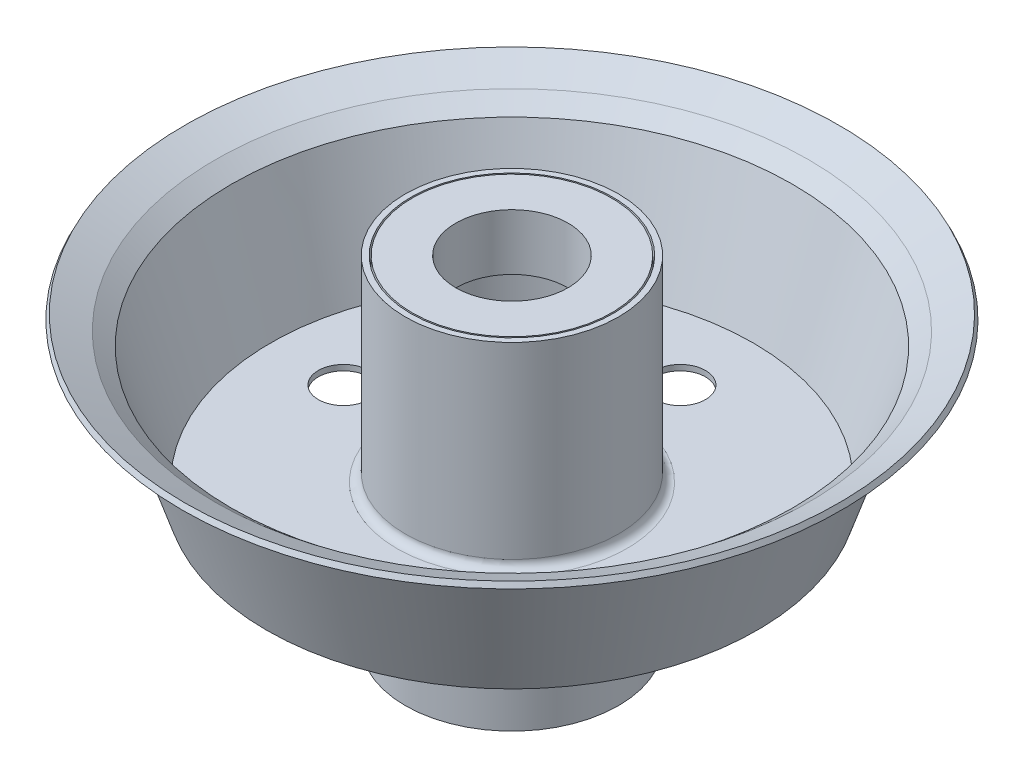
ISO-10303-21;
HEADER;
FILE_DESCRIPTION(('STEP AP214'),'2;1');
FILE_NAME('part.step','',(''),(''),'','','');
FILE_SCHEMA(('AUTOMOTIVE_DESIGN { 1 0 10303 214 1 1 1 1 }'));
ENDSEC;
DATA;
#1=APPLICATION_CONTEXT('core data for automotive mechanical design processes');
#2=APPLICATION_PROTOCOL_DEFINITION('international standard','automotive_design',2000,#1);
#3=PRODUCT_CONTEXT('',#1,'mechanical');
#4=PRODUCT('Part','Part','',(#3));
#5=PRODUCT_RELATED_PRODUCT_CATEGORY('part','',(#4));
#6=PRODUCT_DEFINITION_FORMATION('','',#4);
#7=PRODUCT_DEFINITION_CONTEXT('part definition',#1,'design');
#8=PRODUCT_DEFINITION('design','',#6,#7);
#9=PRODUCT_DEFINITION_SHAPE('','',#8);
#10=(LENGTH_UNIT() NAMED_UNIT(*) SI_UNIT(.MILLI.,.METRE.));
#11=(NAMED_UNIT(*) PLANE_ANGLE_UNIT() SI_UNIT($,.RADIAN.));
#12=(NAMED_UNIT(*) SI_UNIT($,.STERADIAN.) SOLID_ANGLE_UNIT());
#13=UNCERTAINTY_MEASURE_WITH_UNIT(LENGTH_MEASURE(1.E-05),#10,'distance_accuracy_value','');
#14=(GEOMETRIC_REPRESENTATION_CONTEXT(3) GLOBAL_UNCERTAINTY_ASSIGNED_CONTEXT((#13)) GLOBAL_UNIT_ASSIGNED_CONTEXT((#10,
#11,#12)) REPRESENTATION_CONTEXT('',''));
#15=CARTESIAN_POINT('',(0.,0.,0.));
#16=DIRECTION('',(0.,0.,1.));
#17=DIRECTION('',(1.,0.,0.));
#18=AXIS2_PLACEMENT_3D('',#15,#16,#17);
#19=CARTESIAN_POINT('',(0.,-25.,0.));
#20=DIRECTION('',(0.,1.,0.));
#21=DIRECTION('',(0.,0.,1.));
#22=AXIS2_PLACEMENT_3D('',#19,#20,#21);
#23=CYLINDRICAL_SURFACE('',#22,17.75);
#24=CARTESIAN_POINT('',(0.,-25.,0.));
#25=DIRECTION('',(0.,1.,0.));
#26=DIRECTION('',(0.,0.,1.));
#27=AXIS2_PLACEMENT_3D('',#24,#25,#26);
#28=CIRCLE('',#27,17.75);
#29=CARTESIAN_POINT('',(0.,-25.,17.75));
#30=VERTEX_POINT('',#29);
#31=EDGE_CURVE('E11',#30,#30,#28,.T.);
#32=ORIENTED_EDGE('',*,*,#31,.T.);
#33=EDGE_LOOP('',(#32));
#34=FACE_BOUND('',#33,.T.);
#35=CARTESIAN_POINT('',(0.,-15.,0.));
#36=DIRECTION('',(0.,1.,0.));
#37=DIRECTION('',(0.,0.,1.));
#38=AXIS2_PLACEMENT_3D('',#35,#36,#37);
#39=CIRCLE('',#38,17.75);
#40=CARTESIAN_POINT('',(0.,-15.,17.75));
#41=VERTEX_POINT('',#40);
#42=EDGE_CURVE('E40',#41,#41,#39,.T.);
#43=ORIENTED_EDGE('',*,*,#42,.F.);
#44=EDGE_LOOP('',(#43));
#45=FACE_BOUND('',#44,.T.);
#46=ADVANCED_FACE('F37',(#34,#45),#23,.T.);
#47=CARTESIAN_POINT('',(0.,-25.,0.));
#48=DIRECTION('',(0.,1.,0.));
#49=DIRECTION('',(0.,0.,1.));
#50=AXIS2_PLACEMENT_3D('',#47,#48,#49);
#51=PLANE('',#50);
#52=CARTESIAN_POINT('',(0.,-25.,0.));
#53=DIRECTION('',(0.,1.,0.));
#54=DIRECTION('',(0.,0.,1.));
#55=AXIS2_PLACEMENT_3D('',#52,#53,#54);
#56=CIRCLE('',#55,10.);
#57=CARTESIAN_POINT('',(0.,-25.,10.));
#58=VERTEX_POINT('',#57);
#59=EDGE_CURVE('E47',#58,#58,#56,.T.);
#60=ORIENTED_EDGE('',*,*,#59,.T.);
#61=EDGE_LOOP('',(#60));
#62=FACE_BOUND('',#61,.T.);
#63=ORIENTED_EDGE('',*,*,#31,.F.);
#64=EDGE_LOOP('',(#63));
#65=FACE_BOUND('',#64,.T.);
#66=ADVANCED_FACE('F55',(#62,#65),#51,.F.);
#67=CARTESIAN_POINT('',(0.,-15.,0.));
#68=DIRECTION('',(0.,1.,0.));
#69=DIRECTION('',(0.,0.,1.));
#70=AXIS2_PLACEMENT_3D('',#67,#68,#69);
#71=PLANE('',#70);
#72=CARTESIAN_POINT('',(0.,-15.,0.));
#73=DIRECTION('',(0.,1.,0.));
#74=DIRECTION('',(0.,0.,1.));
#75=AXIS2_PLACEMENT_3D('',#72,#73,#74);
#76=CIRCLE('',#75,10.);
#77=CARTESIAN_POINT('',(0.,-15.,10.));
#78=VERTEX_POINT('',#77);
#79=EDGE_CURVE('E49',#78,#78,#76,.T.);
#80=ORIENTED_EDGE('',*,*,#79,.F.);
#81=EDGE_LOOP('',(#80));
#82=FACE_BOUND('',#81,.T.);
#83=ORIENTED_EDGE('',*,*,#42,.T.);
#84=EDGE_LOOP('',(#83));
#85=FACE_BOUND('',#84,.T.);
#86=ADVANCED_FACE('F61',(#82,#85),#71,.T.);
#87=CARTESIAN_POINT('',(0.,-25.,0.));
#88=DIRECTION('',(0.,1.,0.));
#89=DIRECTION('',(0.,0.,1.));
#90=AXIS2_PLACEMENT_3D('',#87,#88,#89);
#91=CYLINDRICAL_SURFACE('',#90,10.);
#92=ORIENTED_EDGE('',*,*,#59,.F.);
#93=EDGE_LOOP('',(#92));
#94=FACE_BOUND('',#93,.T.);
#95=ORIENTED_EDGE('',*,*,#79,.T.);
#96=EDGE_LOOP('',(#95));
#97=FACE_BOUND('',#96,.T.);
#98=ADVANCED_FACE('F58',(#94,#97),#91,.F.);
#99=CLOSED_SHELL('',(#46,#66,#86,#98));
#100=MANIFOLD_SOLID_BREP('B2',#99);
#101=CARTESIAN_POINT('',(0.,35.,0.));
#102=DIRECTION('',(0.,1.,0.));
#103=DIRECTION('',(0.,0.,1.));
#104=AXIS2_PLACEMENT_3D('',#101,#102,#103);
#105=PLANE('',#104);
#106=CARTESIAN_POINT('',(0.,35.,0.));
#107=DIRECTION('',(0.,1.,0.));
#108=DIRECTION('',(0.,0.,1.));
#109=AXIS2_PLACEMENT_3D('',#106,#107,#108);
#110=CIRCLE('',#109,17.75);
#111=CARTESIAN_POINT('',(0.,35.,17.75));
#112=VERTEX_POINT('',#111);
#113=EDGE_CURVE('E36',#112,#112,#110,.T.);
#114=ORIENTED_EDGE('',*,*,#113,.T.);
#115=EDGE_LOOP('',(#114));
#116=FACE_BOUND('',#115,.T.);
#117=CARTESIAN_POINT('',(0.,35.,0.));
#118=DIRECTION('',(0.,1.,0.));
#119=DIRECTION('',(0.,0.,1.));
#120=AXIS2_PLACEMENT_3D('',#117,#118,#119);
#121=CIRCLE('',#120,10.);
#122=CARTESIAN_POINT('',(0.,35.,10.));
#123=VERTEX_POINT('',#122);
#124=EDGE_CURVE('E116',#123,#123,#121,.T.);
#125=ORIENTED_EDGE('',*,*,#124,.F.);
#126=EDGE_LOOP('',(#125));
#127=FACE_BOUND('',#126,.T.);
#128=ADVANCED_FACE('F105',(#116,#127),#105,.T.);
#129=CARTESIAN_POINT('',(0.,25.,0.));
#130=DIRECTION('',(0.,1.,0.));
#131=DIRECTION('',(0.,0.,1.));
#132=AXIS2_PLACEMENT_3D('',#129,#130,#131);
#133=PLANE('',#132);
#134=CARTESIAN_POINT('',(0.,25.,0.));
#135=DIRECTION('',(0.,1.,0.));
#136=DIRECTION('',(0.,0.,1.));
#137=AXIS2_PLACEMENT_3D('',#134,#135,#136);
#138=CIRCLE('',#137,17.75);
#139=CARTESIAN_POINT('',(0.,25.,17.75));
#140=VERTEX_POINT('',#139);
#141=EDGE_CURVE('E109',#140,#140,#138,.T.);
#142=ORIENTED_EDGE('',*,*,#141,.F.);
#143=EDGE_LOOP('',(#142));
#144=FACE_BOUND('',#143,.T.);
#145=CARTESIAN_POINT('',(0.,25.,0.));
#146=DIRECTION('',(0.,1.,0.));
#147=DIRECTION('',(0.,0.,1.));
#148=AXIS2_PLACEMENT_3D('',#145,#146,#147);
#149=CIRCLE('',#148,10.);
#150=CARTESIAN_POINT('',(0.,25.,10.));
#151=VERTEX_POINT('',#150);
#152=EDGE_CURVE('E118',#151,#151,#149,.T.);
#153=ORIENTED_EDGE('',*,*,#152,.T.);
#154=EDGE_LOOP('',(#153));
#155=FACE_BOUND('',#154,.T.);
#156=ADVANCED_FACE('F128',(#144,#155),#133,.F.);
#157=CARTESIAN_POINT('',(0.,35.,0.));
#158=DIRECTION('',(0.,-1.,0.));
#159=DIRECTION('',(0.,0.,-1.));
#160=AXIS2_PLACEMENT_3D('',#157,#158,#159);
#161=CYLINDRICAL_SURFACE('',#160,17.75);
#162=ORIENTED_EDGE('',*,*,#113,.F.);
#163=EDGE_LOOP('',(#162));
#164=FACE_BOUND('',#163,.T.);
#165=ORIENTED_EDGE('',*,*,#141,.T.);
#166=EDGE_LOOP('',(#165));
#167=FACE_BOUND('',#166,.T.);
#168=ADVANCED_FACE('F107',(#164,#167),#161,.T.);
#169=CARTESIAN_POINT('',(0.,35.,0.));
#170=DIRECTION('',(0.,-1.,0.));
#171=DIRECTION('',(0.,0.,-1.));
#172=AXIS2_PLACEMENT_3D('',#169,#170,#171);
#173=CYLINDRICAL_SURFACE('',#172,10.);
#174=ORIENTED_EDGE('',*,*,#124,.T.);
#175=EDGE_LOOP('',(#174));
#176=FACE_BOUND('',#175,.T.);
#177=ORIENTED_EDGE('',*,*,#152,.F.);
#178=EDGE_LOOP('',(#177));
#179=FACE_BOUND('',#178,.T.);
#180=ADVANCED_FACE('F124',(#176,#179),#173,.F.);
#181=CLOSED_SHELL('',(#128,#156,#168,#180));
#182=MANIFOLD_SOLID_BREP('B6',#181);
#183=CARTESIAN_POINT('',(0.,22.482072549379,0.));
#184=DIRECTION('',(0.,1.,0.));
#185=DIRECTION('',(0.,0.,1.));
#186=AXIS2_PLACEMENT_3D('',#183,#184,#185);
#187=CONICAL_SURFACE('',#186,53.4284746095807,1.11990759501973);
#188=CARTESIAN_POINT('',(0.,25.052946122985,0.));
#189=DIRECTION('',(0.,1.,0.));
#190=DIRECTION('',(0.,0.,1.));
#191=AXIS2_PLACEMENT_3D('',#188,#189,#190);
#192=CIRCLE('',#191,58.738533119433);
#193=CARTESIAN_POINT('',(0.,25.052946122985,58.738533119433));
#194=VERTEX_POINT('',#193);
#195=EDGE_CURVE('E228',#194,#194,#192,.T.);
#196=ORIENTED_EDGE('',*,*,#195,.F.);
#197=EDGE_LOOP('',(#196));
#198=FACE_BOUND('',#197,.T.);
#199=CARTESIAN_POINT('',(0.,22.482072549379,0.));
#200=DIRECTION('',(0.,1.,0.));
#201=DIRECTION('',(0.,0.,1.));
#202=AXIS2_PLACEMENT_3D('',#199,#200,#201);
#203=CIRCLE('',#202,53.4284746095807);
#204=CARTESIAN_POINT('',(0.,22.482072549379,53.4284746095807));
#205=VERTEX_POINT('',#204);
#206=EDGE_CURVE('E180',#205,#205,#203,.T.);
#207=ORIENTED_EDGE('',*,*,#206,.T.);
#208=EDGE_LOOP('',(#207));
#209=FACE_BOUND('',#208,.T.);
#210=ADVANCED_FACE('F167',(#198,#209),#187,.T.);
#211=CARTESIAN_POINT('',(0.,20.4058385928895,0.));
#212=DIRECTION('',(0.,1.,0.));
#213=DIRECTION('',(0.,0.,1.));
#214=AXIS2_PLACEMENT_3D('',#211,#212,#213);
#215=CONICAL_SURFACE('',#214,50.8560387510196,0.891736147908962);
#216=ORIENTED_EDGE('',*,*,#206,.F.);
#217=EDGE_LOOP('',(#216));
#218=FACE_BOUND('',#217,.T.);
#219=CARTESIAN_POINT('',(0.,20.4058385928895,0.));
#220=DIRECTION('',(0.,1.,0.));
#221=DIRECTION('',(0.,0.,1.));
#222=AXIS2_PLACEMENT_3D('',#219,#220,#221);
#223=CIRCLE('',#222,50.8560387510196);
#224=CARTESIAN_POINT('',(0.,20.4058385928895,50.8560387510196));
#225=VERTEX_POINT('',#224);
#226=EDGE_CURVE('E246',#225,#225,#223,.T.);
#227=ORIENTED_EDGE('',*,*,#226,.T.);
#228=EDGE_LOOP('',(#227));
#229=FACE_BOUND('',#228,.T.);
#230=ADVANCED_FACE('F288',(#218,#229),#215,.T.);
#231=CARTESIAN_POINT('',(0.,-1.00000000000821,0.));
#232=DIRECTION('',(0.,1.,0.));
#233=DIRECTION('',(0.,0.,1.));
#234=AXIS2_PLACEMENT_3D('',#231,#232,#233);
#235=CONICAL_SURFACE('',#234,43.7207592200747,0.321750554395756);
#236=ORIENTED_EDGE('',*,*,#226,.F.);
#237=EDGE_LOOP('',(#236));
#238=FACE_BOUND('',#237,.T.);
#239=CARTESIAN_POINT('',(0.,-1.00000000000821,0.));
#240=DIRECTION('',(0.,1.,0.));
#241=DIRECTION('',(0.,0.,1.));
#242=AXIS2_PLACEMENT_3D('',#239,#240,#241);
#243=CIRCLE('',#242,43.7207592200747);
#244=CARTESIAN_POINT('',(0.,-1.00000000000821,43.7207592200747));
#245=VERTEX_POINT('',#244);
#246=EDGE_CURVE('E243',#245,#245,#243,.T.);
#247=ORIENTED_EDGE('',*,*,#246,.T.);
#248=EDGE_LOOP('',(#247));
#249=FACE_BOUND('',#248,.T.);
#250=ADVANCED_FACE('F293',(#238,#249),#235,.T.);
#251=CARTESIAN_POINT('',(19.0000000000179,-1.00000000000821,0.));
#252=DIRECTION('',(0.,1.,0.));
#253=DIRECTION('',(0.,0.,1.));
#254=AXIS2_PLACEMENT_3D('',#251,#252,#253);
#255=PLANE('',#254);
#256=CARTESIAN_POINT('',(22.360679775022,-1.00000000000821,20.));
#257=DIRECTION('',(0.,1.,0.));
#258=DIRECTION('',(0.,0.,1.));
#259=AXIS2_PLACEMENT_3D('',#256,#257,#258);
#260=CIRCLE('',#259,3.);
#261=CARTESIAN_POINT('',(22.360679775022,-1.00000000000821,23.));
#262=VERTEX_POINT('',#261);
#263=EDGE_CURVE('E186',#262,#262,#260,.T.);
#264=ORIENTED_EDGE('',*,*,#263,.T.);
#265=EDGE_LOOP('',(#264));
#266=FACE_BOUND('',#265,.T.);
#267=CARTESIAN_POINT('',(-22.360679775022,-1.00000000000821,-20.));
#268=DIRECTION('',(0.,1.,0.));
#269=DIRECTION('',(0.,0.,1.));
#270=AXIS2_PLACEMENT_3D('',#267,#268,#269);
#271=CIRCLE('',#270,3.);
#272=CARTESIAN_POINT('',(-22.360679775022,-1.00000000000821,-17.));
#273=VERTEX_POINT('',#272);
#274=EDGE_CURVE('E185',#273,#273,#271,.T.);
#275=ORIENTED_EDGE('',*,*,#274,.T.);
#276=EDGE_LOOP('',(#275));
#277=FACE_BOUND('',#276,.T.);
#278=CARTESIAN_POINT('',(0.,-1.00000000000821,30.0000000000179));
#279=DIRECTION('',(0.,1.,0.));
#280=DIRECTION('',(0.,0.,1.));
#281=AXIS2_PLACEMENT_3D('',#278,#279,#280);
#282=CIRCLE('',#281,4.49999999999999);
#283=CARTESIAN_POINT('',(0.,-1.00000000000821,34.5000000000179));
#284=VERTEX_POINT('',#283);
#285=EDGE_CURVE('E213',#284,#284,#282,.T.);
#286=ORIENTED_EDGE('',*,*,#285,.T.);
#287=EDGE_LOOP('',(#286));
#288=FACE_BOUND('',#287,.T.);
#289=CARTESIAN_POINT('',(0.,-1.00000000000821,-30.0000000000179));
#290=DIRECTION('',(0.,1.,0.));
#291=DIRECTION('',(0.,0.,1.));
#292=AXIS2_PLACEMENT_3D('',#289,#290,#291);
#293=CIRCLE('',#292,4.5);
#294=CARTESIAN_POINT('',(0.,-1.00000000000821,-25.5000000000179));
#295=VERTEX_POINT('',#294);
#296=EDGE_CURVE('E217',#295,#295,#293,.T.);
#297=ORIENTED_EDGE('',*,*,#296,.T.);
#298=EDGE_LOOP('',(#297));
#299=FACE_BOUND('',#298,.T.);
#300=CARTESIAN_POINT('',(-30.0000000000179,-1.00000000000821,0.));
#301=DIRECTION('',(0.,1.,0.));
#302=DIRECTION('',(0.,0.,1.));
#303=AXIS2_PLACEMENT_3D('',#300,#301,#302);
#304=CIRCLE('',#303,4.5);
#305=CARTESIAN_POINT('',(-30.0000000000179,-1.00000000000821,4.5));
#306=VERTEX_POINT('',#305);
#307=EDGE_CURVE('E221',#306,#306,#304,.T.);
#308=ORIENTED_EDGE('',*,*,#307,.T.);
#309=EDGE_LOOP('',(#308));
#310=FACE_BOUND('',#309,.T.);
#311=CARTESIAN_POINT('',(30.0000000000179,-1.00000000000821,0.));
#312=DIRECTION('',(0.,1.,0.));
#313=DIRECTION('',(0.,0.,1.));
#314=AXIS2_PLACEMENT_3D('',#311,#312,#313);
#315=CIRCLE('',#314,4.5);
#316=CARTESIAN_POINT('',(30.0000000000179,-1.00000000000821,4.5));
#317=VERTEX_POINT('',#316);
#318=EDGE_CURVE('E225',#317,#317,#315,.T.);
#319=ORIENTED_EDGE('',*,*,#318,.T.);
#320=EDGE_LOOP('',(#319));
#321=FACE_BOUND('',#320,.T.);
#322=ORIENTED_EDGE('',*,*,#246,.F.);
#323=EDGE_LOOP('',(#322));
#324=FACE_BOUND('',#323,.T.);
#325=CARTESIAN_POINT('',(0.,-1.00000000000821,0.));
#326=DIRECTION('',(0.,1.,0.));
#327=DIRECTION('',(0.,0.,1.));
#328=AXIS2_PLACEMENT_3D('',#325,#326,#327);
#329=CIRCLE('',#328,19.0000000000179);
#330=CARTESIAN_POINT('',(0.,-1.00000000000821,19.0000000000179));
#331=VERTEX_POINT('',#330);
#332=EDGE_CURVE('E209',#331,#331,#329,.F.);
#333=ORIENTED_EDGE('',*,*,#332,.F.);
#334=EDGE_LOOP('',(#333));
#335=FACE_BOUND('',#334,.T.);
#336=ADVANCED_FACE('F266',(#266,#277,#288,#299,#310,#321,#324,#335),#255,.F.);
#337=CARTESIAN_POINT('',(19.0000000000179,-8.20985384275657E-12,0.));
#338=DIRECTION('',(0.,1.,0.));
#339=DIRECTION('',(0.,0.,1.));
#340=AXIS2_PLACEMENT_3D('',#337,#338,#339);
#341=PLANE('',#340);
#342=CARTESIAN_POINT('',(22.360679775022,-8.21044621179823E-12,20.));
#343=DIRECTION('',(0.,1.,0.));
#344=DIRECTION('',(0.,0.,1.));
#345=AXIS2_PLACEMENT_3D('',#342,#343,#344);
#346=CIRCLE('',#345,3.);
#347=CARTESIAN_POINT('',(22.360679775022,-8.21044621179823E-12,23.));
#348=VERTEX_POINT('',#347);
#349=EDGE_CURVE('E171',#348,#348,#346,.T.);
#350=ORIENTED_EDGE('',*,*,#349,.F.);
#351=EDGE_LOOP('',(#350));
#352=FACE_BOUND('',#351,.T.);
#353=CARTESIAN_POINT('',(-22.360679775022,-8.21044621179823E-12,-20.));
#354=DIRECTION('',(0.,1.,0.));
#355=DIRECTION('',(0.,0.,1.));
#356=AXIS2_PLACEMENT_3D('',#353,#354,#355);
#357=CIRCLE('',#356,3.);
#358=CARTESIAN_POINT('',(-22.360679775022,-8.21044621179823E-12,-17.));
#359=VERTEX_POINT('',#358);
#360=EDGE_CURVE('E183',#359,#359,#357,.T.);
#361=ORIENTED_EDGE('',*,*,#360,.F.);
#362=EDGE_LOOP('',(#361));
#363=FACE_BOUND('',#362,.T.);
#364=CARTESIAN_POINT('',(0.,-8.20979569049474E-12,0.));
#365=DIRECTION('',(0.,1.,0.));
#366=DIRECTION('',(0.,0.,1.));
#367=AXIS2_PLACEMENT_3D('',#364,#365,#366);
#368=CIRCLE('',#367,20.5000000000179);
#369=CARTESIAN_POINT('',(0.,-8.20979569049474E-12,20.5000000000179));
#370=VERTEX_POINT('',#369);
#371=EDGE_CURVE('E104',#370,#370,#368,.F.);
#372=ORIENTED_EDGE('',*,*,#371,.T.);
#373=EDGE_LOOP('',(#372));
#374=FACE_BOUND('',#373,.T.);
#375=CARTESIAN_POINT('',(0.,-8.20871148832225E-12,30.0000000000179));
#376=DIRECTION('',(0.,1.,0.));
#377=DIRECTION('',(0.,0.,1.));
#378=AXIS2_PLACEMENT_3D('',#375,#376,#377);
#379=CIRCLE('',#378,4.49999999999999);
#380=CARTESIAN_POINT('',(0.,-8.20871148832225E-12,34.5000000000179));
#381=VERTEX_POINT('',#380);
#382=EDGE_CURVE('E212',#381,#381,#379,.T.);
#383=ORIENTED_EDGE('',*,*,#382,.F.);
#384=EDGE_LOOP('',(#383));
#385=FACE_BOUND('',#384,.T.);
#386=CARTESIAN_POINT('',(0.,-8.20871148832225E-12,-30.0000000000179));
#387=DIRECTION('',(0.,1.,0.));
#388=DIRECTION('',(0.,0.,1.));
#389=AXIS2_PLACEMENT_3D('',#386,#387,#388);
#390=CIRCLE('',#389,4.5);
#391=CARTESIAN_POINT('',(0.,-8.20871148832225E-12,-25.5000000000179));
#392=VERTEX_POINT('',#391);
#393=EDGE_CURVE('E216',#392,#392,#390,.T.);
#394=ORIENTED_EDGE('',*,*,#393,.F.);
#395=EDGE_LOOP('',(#394));
#396=FACE_BOUND('',#395,.T.);
#397=CARTESIAN_POINT('',(-30.0000000000179,-8.20871148832225E-12,0.));
#398=DIRECTION('',(0.,1.,0.));
#399=DIRECTION('',(0.,0.,1.));
#400=AXIS2_PLACEMENT_3D('',#397,#398,#399);
#401=CIRCLE('',#400,4.5);
#402=CARTESIAN_POINT('',(-30.0000000000179,-8.20871148832225E-12,4.5));
#403=VERTEX_POINT('',#402);
#404=EDGE_CURVE('E220',#403,#403,#401,.T.);
#405=ORIENTED_EDGE('',*,*,#404,.F.);
#406=EDGE_LOOP('',(#405));
#407=FACE_BOUND('',#406,.T.);
#408=CARTESIAN_POINT('',(30.0000000000179,-8.20871148832225E-12,0.));
#409=DIRECTION('',(0.,1.,0.));
#410=DIRECTION('',(0.,0.,1.));
#411=AXIS2_PLACEMENT_3D('',#408,#409,#410);
#412=CIRCLE('',#411,4.5);
#413=CARTESIAN_POINT('',(30.0000000000179,-8.20871148832225E-12,4.5));
#414=VERTEX_POINT('',#413);
#415=EDGE_CURVE('E224',#414,#414,#412,.T.);
#416=ORIENTED_EDGE('',*,*,#415,.F.);
#417=EDGE_LOOP('',(#416));
#418=FACE_BOUND('',#417,.T.);
#419=CARTESIAN_POINT('',(0.,-8.20985384275657E-12,0.));
#420=DIRECTION('',(0.,1.,0.));
#421=DIRECTION('',(0.,0.,1.));
#422=AXIS2_PLACEMENT_3D('',#419,#420,#421);
#423=CIRCLE('',#422,43.0000000000179);
#424=CARTESIAN_POINT('',(0.,-8.20985384275657E-12,43.0000000000179));
#425=VERTEX_POINT('',#424);
#426=EDGE_CURVE('E240',#425,#425,#423,.T.);
#427=ORIENTED_EDGE('',*,*,#426,.T.);
#428=EDGE_LOOP('',(#427));
#429=FACE_BOUND('',#428,.T.);
#430=ADVANCED_FACE('F262',(#352,#363,#374,#385,#396,#407,#418,#429),#341,.T.);
#431=CARTESIAN_POINT('',(0.,-8.20985384275657E-12,0.));
#432=DIRECTION('',(0.,1.,0.));
#433=DIRECTION('',(0.,0.,1.));
#434=AXIS2_PLACEMENT_3D('',#431,#432,#433);
#435=CONICAL_SURFACE('',#434,43.0000000000179,0.321750554395756);
#436=CARTESIAN_POINT('',(0.,21.,0.));
#437=DIRECTION('',(0.,1.,0.));
#438=DIRECTION('',(0.,0.,1.));
#439=AXIS2_PLACEMENT_3D('',#436,#437,#438);
#440=CIRCLE('',#439,50.);
#441=CARTESIAN_POINT('',(0.,21.,50.));
#442=VERTEX_POINT('',#441);
#443=EDGE_CURVE('E237',#442,#442,#440,.T.);
#444=ORIENTED_EDGE('',*,*,#443,.T.);
#445=EDGE_LOOP('',(#444));
#446=FACE_BOUND('',#445,.T.);
#447=ORIENTED_EDGE('',*,*,#426,.F.);
#448=EDGE_LOOP('',(#447));
#449=FACE_BOUND('',#448,.T.);
#450=ADVANCED_FACE('F265',(#446,#449),#435,.F.);
#451=CARTESIAN_POINT('',(0.,21.,0.));
#452=DIRECTION('',(0.,1.,0.));
#453=DIRECTION('',(0.,0.,1.));
#454=AXIS2_PLACEMENT_3D('',#451,#452,#453);
#455=CONICAL_SURFACE('',#454,50.,0.891736147908962);
#456=CARTESIAN_POINT('',(0.,23.332201275954,0.));
#457=DIRECTION('',(0.,1.,0.));
#458=DIRECTION('',(0.,0.,1.));
#459=AXIS2_PLACEMENT_3D('',#456,#457,#458);
#460=CIRCLE('',#459,52.8895771465901);
#461=CARTESIAN_POINT('',(0.,23.332201275954,52.8895771465901));
#462=VERTEX_POINT('',#461);
#463=EDGE_CURVE('E234',#462,#462,#460,.T.);
#464=ORIENTED_EDGE('',*,*,#463,.T.);
#465=EDGE_LOOP('',(#464));
#466=FACE_BOUND('',#465,.T.);
#467=ORIENTED_EDGE('',*,*,#443,.F.);
#468=EDGE_LOOP('',(#467));
#469=FACE_BOUND('',#468,.T.);
#470=ADVANCED_FACE('F278',(#466,#469),#455,.F.);
#471=CARTESIAN_POINT('',(0.,23.332201275954,0.));
#472=DIRECTION('',(0.,1.,0.));
#473=DIRECTION('',(0.,0.,1.));
#474=AXIS2_PLACEMENT_3D('',#471,#472,#473);
#475=CONICAL_SURFACE('',#474,52.8895771465901,1.11990759501973);
#476=CARTESIAN_POINT('',(0.,25.9530063020908,0.));
#477=DIRECTION('',(0.,1.,0.));
#478=DIRECTION('',(0.,0.,1.));
#479=AXIS2_PLACEMENT_3D('',#476,#477,#478);
#480=CIRCLE('',#479,58.3027675012528);
#481=CARTESIAN_POINT('',(0.,25.9530063020908,58.3027675012528));
#482=VERTEX_POINT('',#481);
#483=EDGE_CURVE('E231',#482,#482,#480,.T.);
#484=ORIENTED_EDGE('',*,*,#483,.T.);
#485=EDGE_LOOP('',(#484));
#486=FACE_BOUND('',#485,.T.);
#487=ORIENTED_EDGE('',*,*,#463,.F.);
#488=EDGE_LOOP('',(#487));
#489=FACE_BOUND('',#488,.T.);
#490=ADVANCED_FACE('F284',(#486,#489),#475,.F.);
#491=CARTESIAN_POINT('',(0.,25.9530063020908,0.));
#492=DIRECTION('',(0.,-1.,0.));
#493=DIRECTION('',(0.,0.,-1.));
#494=AXIS2_PLACEMENT_3D('',#491,#492,#493);
#495=CONICAL_SURFACE('',#494,58.3027675012528,0.450888731775172);
#496=ORIENTED_EDGE('',*,*,#195,.T.);
#497=EDGE_LOOP('',(#496));
#498=FACE_BOUND('',#497,.T.);
#499=ORIENTED_EDGE('',*,*,#483,.F.);
#500=EDGE_LOOP('',(#499));
#501=FACE_BOUND('',#500,.T.);
#502=ADVANCED_FACE('F413',(#498,#501),#495,.T.);
#503=CARTESIAN_POINT('',(30.0000000000179,-40.,0.));
#504=DIRECTION('',(0.,1.,0.));
#505=DIRECTION('',(0.,0.,1.));
#506=AXIS2_PLACEMENT_3D('',#503,#504,#505);
#507=CYLINDRICAL_SURFACE('',#506,4.5);
#508=ORIENTED_EDGE('',*,*,#415,.T.);
#509=EDGE_LOOP('',(#508));
#510=FACE_BOUND('',#509,.T.);
#511=ORIENTED_EDGE('',*,*,#318,.F.);
#512=EDGE_LOOP('',(#511));
#513=FACE_BOUND('',#512,.T.);
#514=ADVANCED_FACE('F422',(#510,#513),#507,.F.);
#515=CARTESIAN_POINT('',(-30.0000000000179,-40.,0.));
#516=DIRECTION('',(0.,1.,0.));
#517=DIRECTION('',(0.,0.,1.));
#518=AXIS2_PLACEMENT_3D('',#515,#516,#517);
#519=CYLINDRICAL_SURFACE('',#518,4.5);
#520=ORIENTED_EDGE('',*,*,#404,.T.);
#521=EDGE_LOOP('',(#520));
#522=FACE_BOUND('',#521,.T.);
#523=ORIENTED_EDGE('',*,*,#307,.F.);
#524=EDGE_LOOP('',(#523));
#525=FACE_BOUND('',#524,.T.);
#526=ADVANCED_FACE('F431',(#522,#525),#519,.F.);
#527=CARTESIAN_POINT('',(0.,-40.,-30.0000000000179));
#528=DIRECTION('',(0.,1.,0.));
#529=DIRECTION('',(0.,0.,1.));
#530=AXIS2_PLACEMENT_3D('',#527,#528,#529);
#531=CYLINDRICAL_SURFACE('',#530,4.5);
#532=ORIENTED_EDGE('',*,*,#393,.T.);
#533=EDGE_LOOP('',(#532));
#534=FACE_BOUND('',#533,.T.);
#535=ORIENTED_EDGE('',*,*,#296,.F.);
#536=EDGE_LOOP('',(#535));
#537=FACE_BOUND('',#536,.T.);
#538=ADVANCED_FACE('F332',(#534,#537),#531,.F.);
#539=CARTESIAN_POINT('',(0.,-40.,30.0000000000179));
#540=DIRECTION('',(0.,1.,0.));
#541=DIRECTION('',(0.,0.,1.));
#542=AXIS2_PLACEMENT_3D('',#539,#540,#541);
#543=CYLINDRICAL_SURFACE('',#542,4.49999999999999);
#544=ORIENTED_EDGE('',*,*,#382,.T.);
#545=EDGE_LOOP('',(#544));
#546=FACE_BOUND('',#545,.T.);
#547=ORIENTED_EDGE('',*,*,#285,.F.);
#548=EDGE_LOOP('',(#547));
#549=FACE_BOUND('',#548,.T.);
#550=ADVANCED_FACE('F259',(#546,#549),#543,.F.);
#551=CARTESIAN_POINT('',(0.,35.,0.));
#552=DIRECTION('',(0.,-1.,0.));
#553=DIRECTION('',(0.,0.,-1.));
#554=AXIS2_PLACEMENT_3D('',#551,#552,#553);
#555=CYLINDRICAL_SURFACE('',#554,19.0000000000179);
#556=CARTESIAN_POINT('',(0.,-25.,0.));
#557=DIRECTION('',(0.,1.,0.));
#558=DIRECTION('',(0.,0.,1.));
#559=AXIS2_PLACEMENT_3D('',#556,#557,#558);
#560=CIRCLE('',#559,19.0000000000179);
#561=CARTESIAN_POINT('',(0.,-25.,19.0000000000179));
#562=VERTEX_POINT('',#561);
#563=EDGE_CURVE('E200',#562,#562,#560,.T.);
#564=ORIENTED_EDGE('',*,*,#563,.T.);
#565=EDGE_LOOP('',(#564));
#566=FACE_BOUND('',#565,.T.);
#567=ORIENTED_EDGE('',*,*,#332,.T.);
#568=EDGE_LOOP('',(#567));
#569=FACE_BOUND('',#568,.T.);
#570=ADVANCED_FACE('F320',(#566,#569),#555,.T.);
#571=CARTESIAN_POINT('',(0.,35.,0.));
#572=DIRECTION('',(0.,1.,0.));
#573=DIRECTION('',(0.,0.,1.));
#574=AXIS2_PLACEMENT_3D('',#571,#572,#573);
#575=PLANE('',#574);
#576=CARTESIAN_POINT('',(0.,35.,0.));
#577=DIRECTION('',(0.,1.,0.));
#578=DIRECTION('',(0.,0.,1.));
#579=AXIS2_PLACEMENT_3D('',#576,#577,#578);
#580=CIRCLE('',#579,19.0000000000179);
#581=CARTESIAN_POINT('',(0.,35.,19.0000000000179));
#582=VERTEX_POINT('',#581);
#583=EDGE_CURVE('E206',#582,#582,#580,.T.);
#584=ORIENTED_EDGE('',*,*,#583,.T.);
#585=EDGE_LOOP('',(#584));
#586=FACE_BOUND('',#585,.T.);
#587=CARTESIAN_POINT('',(0.,35.,0.));
#588=DIRECTION('',(0.,1.,0.));
#589=DIRECTION('',(0.,0.,1.));
#590=AXIS2_PLACEMENT_3D('',#587,#588,#589);
#591=CIRCLE('',#590,18.);
#592=CARTESIAN_POINT('',(0.,35.,18.));
#593=VERTEX_POINT('',#592);
#594=EDGE_CURVE('E203',#593,#593,#591,.T.);
#595=ORIENTED_EDGE('',*,*,#594,.F.);
#596=EDGE_LOOP('',(#595));
#597=FACE_BOUND('',#596,.T.);
#598=ADVANCED_FACE('F322',(#586,#597),#575,.T.);
#599=CARTESIAN_POINT('',(0.,1.49999999999179,0.));
#600=DIRECTION('',(0.,1.,0.));
#601=DIRECTION('',(0.,0.,1.));
#602=AXIS2_PLACEMENT_3D('',#599,#600,#601);
#603=CIRCLE('',#602,19.0000000000179);
#604=CARTESIAN_POINT('',(0.,1.49999999999179,19.0000000000179));
#605=VERTEX_POINT('',#604);
#606=EDGE_CURVE('E175',#605,#605,#603,.T.);
#607=ORIENTED_EDGE('',*,*,#606,.T.);
#608=EDGE_LOOP('',(#607));
#609=FACE_BOUND('',#608,.T.);
#610=ORIENTED_EDGE('',*,*,#583,.F.);
#611=EDGE_LOOP('',(#610));
#612=FACE_BOUND('',#611,.T.);
#613=ADVANCED_FACE('F325',(#609,#612),#555,.T.);
#614=CARTESIAN_POINT('',(0.,35.,0.));
#615=DIRECTION('',(0.,-1.,0.));
#616=DIRECTION('',(0.,0.,-1.));
#617=AXIS2_PLACEMENT_3D('',#614,#615,#616);
#618=CYLINDRICAL_SURFACE('',#617,18.);
#619=ORIENTED_EDGE('',*,*,#594,.T.);
#620=EDGE_LOOP('',(#619));
#621=FACE_BOUND('',#620,.T.);
#622=CARTESIAN_POINT('',(0.,-25.,0.));
#623=DIRECTION('',(0.,1.,0.));
#624=DIRECTION('',(0.,0.,1.));
#625=AXIS2_PLACEMENT_3D('',#622,#623,#624);
#626=CIRCLE('',#625,18.);
#627=CARTESIAN_POINT('',(0.,-25.,18.));
#628=VERTEX_POINT('',#627);
#629=EDGE_CURVE('E190',#628,#628,#626,.T.);
#630=ORIENTED_EDGE('',*,*,#629,.F.);
#631=EDGE_LOOP('',(#630));
#632=FACE_BOUND('',#631,.T.);
#633=ADVANCED_FACE('F335',(#621,#632),#618,.F.);
#634=CARTESIAN_POINT('',(0.,-25.,0.));
#635=DIRECTION('',(0.,1.,0.));
#636=DIRECTION('',(0.,0.,1.));
#637=AXIS2_PLACEMENT_3D('',#634,#635,#636);
#638=PLANE('',#637);
#639=ORIENTED_EDGE('',*,*,#629,.T.);
#640=EDGE_LOOP('',(#639));
#641=FACE_BOUND('',#640,.T.);
#642=ORIENTED_EDGE('',*,*,#563,.F.);
#643=EDGE_LOOP('',(#642));
#644=FACE_BOUND('',#643,.T.);
#645=ADVANCED_FACE('F340',(#641,#644),#638,.F.);
#646=CARTESIAN_POINT('',(0.,1.49999999999179,0.));
#647=DIRECTION('',(0.,1.,0.));
#648=DIRECTION('',(0.,0.,1.));
#649=AXIS2_PLACEMENT_3D('',#646,#647,#648);
#650=TOROIDAL_SURFACE('',#649,20.5000000000179,1.5);
#651=ORIENTED_EDGE('',*,*,#371,.F.);
#652=EDGE_LOOP('',(#651));
#653=FACE_BOUND('',#652,.T.);
#654=ORIENTED_EDGE('',*,*,#606,.F.);
#655=EDGE_LOOP('',(#654));
#656=FACE_BOUND('',#655,.T.);
#657=ADVANCED_FACE('F169',(#653,#656),#650,.F.);
#658=CARTESIAN_POINT('',(-22.360679775022,-15.,-20.));
#659=DIRECTION('',(0.,1.,0.));
#660=DIRECTION('',(0.,0.,1.));
#661=AXIS2_PLACEMENT_3D('',#658,#659,#660);
#662=CYLINDRICAL_SURFACE('',#661,3.);
#663=ORIENTED_EDGE('',*,*,#360,.T.);
#664=EDGE_LOOP('',(#663));
#665=FACE_BOUND('',#664,.T.);
#666=ORIENTED_EDGE('',*,*,#274,.F.);
#667=EDGE_LOOP('',(#666));
#668=FACE_BOUND('',#667,.T.);
#669=ADVANCED_FACE('F358',(#665,#668),#662,.F.);
#670=CARTESIAN_POINT('',(22.360679775022,-15.,20.));
#671=DIRECTION('',(0.,1.,0.));
#672=DIRECTION('',(0.,0.,1.));
#673=AXIS2_PLACEMENT_3D('',#670,#671,#672);
#674=CYLINDRICAL_SURFACE('',#673,3.);
#675=ORIENTED_EDGE('',*,*,#349,.T.);
#676=EDGE_LOOP('',(#675));
#677=FACE_BOUND('',#676,.T.);
#678=ORIENTED_EDGE('',*,*,#263,.F.);
#679=EDGE_LOOP('',(#678));
#680=FACE_BOUND('',#679,.T.);
#681=ADVANCED_FACE('F363',(#677,#680),#674,.F.);
#682=CLOSED_SHELL('',(#210,#230,#250,#336,#430,#450,#470,#490,#502,#514,#526,#538,#550,#570,
#598,#613,#633,#645,#657,#669,#681));
#683=MANIFOLD_SOLID_BREP('B31',#682);
#684=ADVANCED_BREP_SHAPE_REPRESENTATION('',(#18,#100,#182,#683),#14);
#685=SHAPE_DEFINITION_REPRESENTATION(#9,#684);
ENDSEC;
END-ISO-10303-21;
